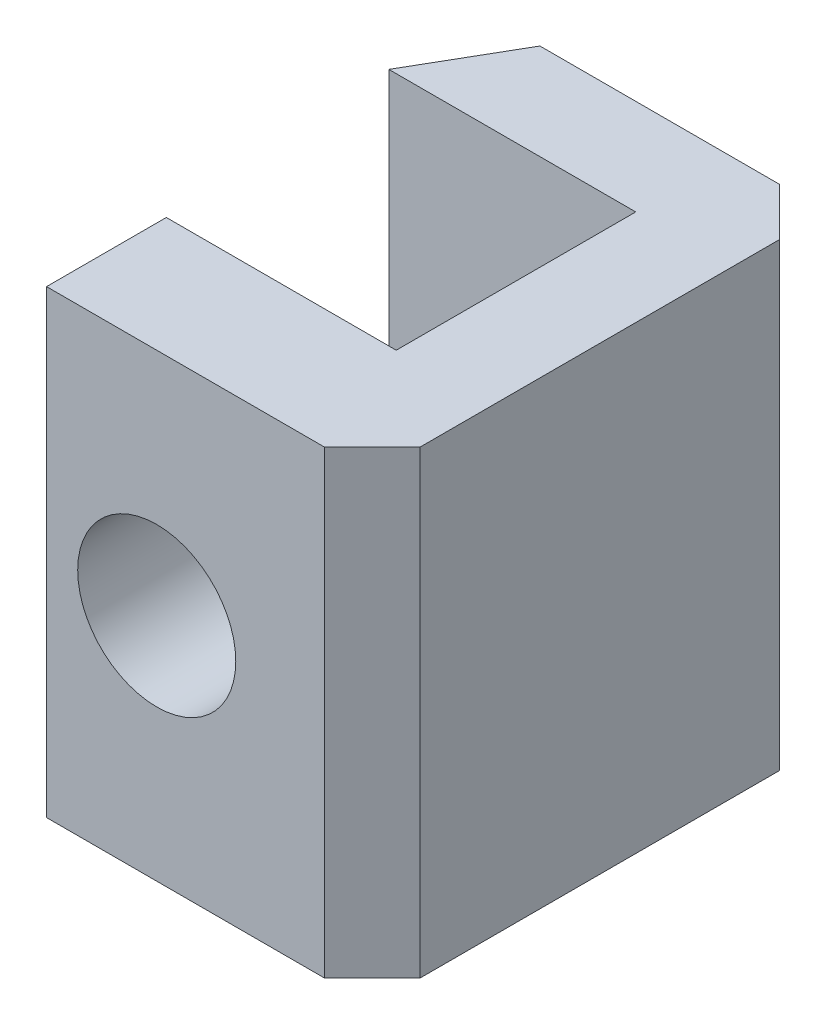
ISO-10303-21;
HEADER;
FILE_DESCRIPTION(('STEP AP214'),'2;1');
FILE_NAME('part.step','',(''),(''),'','','');
FILE_SCHEMA(('AUTOMOTIVE_DESIGN { 1 0 10303 214 1 1 1 1 }'));
ENDSEC;
DATA;
#1=APPLICATION_CONTEXT('core data for automotive mechanical design processes');
#2=APPLICATION_PROTOCOL_DEFINITION('international standard','automotive_design',2000,#1);
#3=PRODUCT_CONTEXT('',#1,'mechanical');
#4=PRODUCT('Part','Part','',(#3));
#5=PRODUCT_RELATED_PRODUCT_CATEGORY('part','',(#4));
#6=PRODUCT_DEFINITION_FORMATION('','',#4);
#7=PRODUCT_DEFINITION_CONTEXT('part definition',#1,'design');
#8=PRODUCT_DEFINITION('design','',#6,#7);
#9=PRODUCT_DEFINITION_SHAPE('','',#8);
#10=(LENGTH_UNIT() NAMED_UNIT(*) SI_UNIT(.MILLI.,.METRE.));
#11=(NAMED_UNIT(*) PLANE_ANGLE_UNIT() SI_UNIT($,.RADIAN.));
#12=(NAMED_UNIT(*) SI_UNIT($,.STERADIAN.) SOLID_ANGLE_UNIT());
#13=UNCERTAINTY_MEASURE_WITH_UNIT(LENGTH_MEASURE(1.E-05),#10,'distance_accuracy_value','');
#14=(GEOMETRIC_REPRESENTATION_CONTEXT(3) GLOBAL_UNCERTAINTY_ASSIGNED_CONTEXT((#13)) GLOBAL_UNIT_ASSIGNED_CONTEXT((#10,
#11,#12)) REPRESENTATION_CONTEXT('',''));
#15=CARTESIAN_POINT('',(0.,0.,0.));
#16=DIRECTION('',(0.,0.,1.));
#17=DIRECTION('',(1.,0.,0.));
#18=AXIS2_PLACEMENT_3D('',#15,#16,#17);
#19=CARTESIAN_POINT('',(26.381498191,-39.8816452622514,0.));
#20=DIRECTION('',(0.,0.,1.));
#21=DIRECTION('',(1.,0.,0.));
#22=AXIS2_PLACEMENT_3D('',#19,#20,#21);
#23=PLANE('',#22);
#24=CARTESIAN_POINT('',(28.681498191,-22.988801204,0.));
#25=DIRECTION('',(0.,0.,1.));
#26=DIRECTION('',(1.,0.,0.));
#27=AXIS2_PLACEMENT_3D('',#24,#25,#26);
#28=CIRCLE('',#27,1.65);
#29=CARTESIAN_POINT('',(30.331498191,-22.988801204,0.));
#30=VERTEX_POINT('',#29);
#31=EDGE_CURVE('E167',#30,#30,#28,.T.);
#32=ORIENTED_EDGE('',*,*,#31,.T.);
#33=EDGE_LOOP('',(#32));
#34=FACE_BOUND('',#33,.T.);
#35=DIRECTION('',(1.,0.,0.));
#36=VECTOR('',#35,1.);
#37=CARTESIAN_POINT('',(26.381498191,-27.788801204,0.));
#38=LINE('',#37,#36);
#39=CARTESIAN_POINT('',(26.381498191,-27.788801204,0.));
#40=VERTEX_POINT('',#39);
#41=CARTESIAN_POINT('',(31.181498191,-27.788801204,0.));
#42=VERTEX_POINT('',#41);
#43=EDGE_CURVE('E146',#40,#42,#38,.T.);
#44=ORIENTED_EDGE('',*,*,#43,.F.);
#45=DIRECTION('',(0.,1.,0.));
#46=VECTOR('',#45,1.);
#47=CARTESIAN_POINT('',(26.381498191,-39.8816452622514,0.));
#48=LINE('',#47,#46);
#49=CARTESIAN_POINT('',(26.381498191,-18.188801204,0.));
#50=VERTEX_POINT('',#49);
#51=EDGE_CURVE('E144',#40,#50,#48,.T.);
#52=ORIENTED_EDGE('',*,*,#51,.T.);
#53=DIRECTION('',(1.,0.,0.));
#54=VECTOR('',#53,1.);
#55=CARTESIAN_POINT('',(26.381498191,-18.188801204,0.));
#56=LINE('',#55,#54);
#57=CARTESIAN_POINT('',(31.181498191,-18.188801204,0.));
#58=VERTEX_POINT('',#57);
#59=EDGE_CURVE('E156',#50,#58,#56,.T.);
#60=ORIENTED_EDGE('',*,*,#59,.T.);
#61=DIRECTION('',(0.,1.,0.));
#62=VECTOR('',#61,1.);
#63=CARTESIAN_POINT('',(31.181498191,-39.8816452622514,0.));
#64=LINE('',#63,#62);
#65=EDGE_CURVE('E153',#42,#58,#64,.T.);
#66=ORIENTED_EDGE('',*,*,#65,.F.);
#67=EDGE_LOOP('',(#44,#52,#60,#66));
#68=FACE_BOUND('',#67,.T.);
#69=ADVANCED_FACE('F44',(#34,#68),#23,.F.);
#70=CARTESIAN_POINT('',(31.181498191,-39.8816452622514,-2.5));
#71=DIRECTION('',(1.,0.,0.));
#72=DIRECTION('',(0.,0.,-1.));
#73=AXIS2_PLACEMENT_3D('',#70,#71,#72);
#74=PLANE('',#73);
#75=DIRECTION('',(0.,0.,-1.));
#76=VECTOR('',#75,1.);
#77=CARTESIAN_POINT('',(31.181498191,-27.788801204,-2.5));
#78=LINE('',#77,#76);
#79=CARTESIAN_POINT('',(31.181498191,-27.788801204,-5.));
#80=VERTEX_POINT('',#79);
#81=EDGE_CURVE('E148',#42,#80,#78,.T.);
#82=ORIENTED_EDGE('',*,*,#81,.F.);
#83=ORIENTED_EDGE('',*,*,#65,.T.);
#84=DIRECTION('',(0.,0.,-1.));
#85=VECTOR('',#84,1.);
#86=CARTESIAN_POINT('',(31.181498191,-18.188801204,-2.5));
#87=LINE('',#86,#85);
#88=CARTESIAN_POINT('',(31.181498191,-18.188801204,-5.));
#89=VERTEX_POINT('',#88);
#90=EDGE_CURVE('E155',#58,#89,#87,.T.);
#91=ORIENTED_EDGE('',*,*,#90,.T.);
#92=DIRECTION('',(0.,1.,0.));
#93=VECTOR('',#92,1.);
#94=CARTESIAN_POINT('',(31.181498191,-39.8816452622514,-5.));
#95=LINE('',#94,#93);
#96=EDGE_CURVE('E157',#80,#89,#95,.T.);
#97=ORIENTED_EDGE('',*,*,#96,.F.);
#98=EDGE_LOOP('',(#82,#83,#91,#97));
#99=FACE_BOUND('',#98,.T.);
#100=ADVANCED_FACE('F218',(#99),#74,.F.);
#101=CARTESIAN_POINT('',(26.0267976526207,-39.8816452622514,-5.));
#102=DIRECTION('',(0.,0.,-1.));
#103=DIRECTION('',(-1.,0.,0.));
#104=AXIS2_PLACEMENT_3D('',#101,#102,#103);
#105=PLANE('',#104);
#106=DIRECTION('',(-1.,0.,0.));
#107=VECTOR('',#106,1.);
#108=CARTESIAN_POINT('',(26.0267976526207,-27.788801204,-5.));
#109=LINE('',#108,#107);
#110=CARTESIAN_POINT('',(26.0267976526207,-27.788801204,-5.));
#111=VERTEX_POINT('',#110);
#112=EDGE_CURVE('E212',#80,#111,#109,.T.);
#113=ORIENTED_EDGE('',*,*,#112,.F.);
#114=ORIENTED_EDGE('',*,*,#96,.T.);
#115=DIRECTION('',(-1.,0.,0.));
#116=VECTOR('',#115,1.);
#117=CARTESIAN_POINT('',(26.0267976526207,-18.188801204,-5.));
#118=LINE('',#117,#116);
#119=CARTESIAN_POINT('',(26.0267976526207,-18.188801204,-5.));
#120=VERTEX_POINT('',#119);
#121=EDGE_CURVE('E159',#89,#120,#118,.T.);
#122=ORIENTED_EDGE('',*,*,#121,.T.);
#123=DIRECTION('',(0.,1.,0.));
#124=VECTOR('',#123,1.);
#125=CARTESIAN_POINT('',(26.0267976526207,-39.8816452622514,-5.));
#126=LINE('',#125,#124);
#127=EDGE_CURVE('E160',#111,#120,#126,.T.);
#128=ORIENTED_EDGE('',*,*,#127,.F.);
#129=EDGE_LOOP('',(#113,#114,#122,#128));
#130=FACE_BOUND('',#129,.T.);
#131=ADVANCED_FACE('F225',(#130),#105,.F.);
#132=CARTESIAN_POINT('',(27.181498191,-39.8816452622514,-7.));
#133=DIRECTION('',(0.866025403784436,0.,0.500000000000005));
#134=DIRECTION('',(0.500000000000005,0.,-0.866025403784436));
#135=AXIS2_PLACEMENT_3D('',#132,#133,#134);
#136=PLANE('',#135);
#137=DIRECTION('',(0.500000000000005,0.,-0.866025403784436));
#138=VECTOR('',#137,1.);
#139=CARTESIAN_POINT('',(27.181498191,-27.788801204,-7.));
#140=LINE('',#139,#138);
#141=CARTESIAN_POINT('',(27.181498191,-27.788801204,-7.));
#142=VERTEX_POINT('',#141);
#143=EDGE_CURVE('E210',#111,#142,#140,.T.);
#144=ORIENTED_EDGE('',*,*,#143,.F.);
#145=ORIENTED_EDGE('',*,*,#127,.T.);
#146=DIRECTION('',(0.500000000000005,0.,-0.866025403784436));
#147=VECTOR('',#146,1.);
#148=CARTESIAN_POINT('',(27.181498191,-18.188801204,-7.));
#149=LINE('',#148,#147);
#150=CARTESIAN_POINT('',(27.181498191,-18.188801204,-7.));
#151=VERTEX_POINT('',#150);
#152=EDGE_CURVE('E162',#120,#151,#149,.T.);
#153=ORIENTED_EDGE('',*,*,#152,.T.);
#154=DIRECTION('',(0.,1.,0.));
#155=VECTOR('',#154,1.);
#156=CARTESIAN_POINT('',(27.181498191,-39.8816452622514,-7.));
#157=LINE('',#156,#155);
#158=EDGE_CURVE('E163',#142,#151,#157,.T.);
#159=ORIENTED_EDGE('',*,*,#158,.F.);
#160=EDGE_LOOP('',(#144,#145,#153,#159));
#161=FACE_BOUND('',#160,.T.);
#162=ADVANCED_FACE('F227',(#161),#136,.F.);
#163=CARTESIAN_POINT('',(33.181498191,-39.8816452622514,-7.));
#164=DIRECTION('',(0.,0.,1.));
#165=DIRECTION('',(1.,0.,0.));
#166=AXIS2_PLACEMENT_3D('',#163,#164,#165);
#167=PLANE('',#166);
#168=DIRECTION('',(1.,0.,0.));
#169=VECTOR('',#168,1.);
#170=CARTESIAN_POINT('',(33.181498191,-18.188801204,-7.));
#171=LINE('',#170,#169);
#172=CARTESIAN_POINT('',(32.181498191,-18.188801204,-7.));
#173=VERTEX_POINT('',#172);
#174=EDGE_CURVE('E164',#151,#173,#171,.T.);
#175=ORIENTED_EDGE('',*,*,#174,.T.);
#176=DIRECTION('',(0.,-1.,0.));
#177=VECTOR('',#176,1.);
#178=CARTESIAN_POINT('',(32.181498191,-39.8816452622514,-7.));
#179=LINE('',#178,#177);
#180=CARTESIAN_POINT('',(32.181498191,-27.788801204,-7.));
#181=VERTEX_POINT('',#180);
#182=EDGE_CURVE('E68',#173,#181,#179,.T.);
#183=ORIENTED_EDGE('',*,*,#182,.T.);
#184=DIRECTION('',(1.,0.,0.));
#185=VECTOR('',#184,1.);
#186=CARTESIAN_POINT('',(33.181498191,-27.788801204,-7.));
#187=LINE('',#186,#185);
#188=EDGE_CURVE('E180',#142,#181,#187,.T.);
#189=ORIENTED_EDGE('',*,*,#188,.F.);
#190=ORIENTED_EDGE('',*,*,#158,.T.);
#191=EDGE_LOOP('',(#175,#183,#189,#190));
#192=FACE_BOUND('',#191,.T.);
#193=ADVANCED_FACE('F195',(#192),#167,.F.);
#194=CARTESIAN_POINT('',(33.181498191,-39.8816452622514,2.5));
#195=DIRECTION('',(-1.,0.,0.));
#196=DIRECTION('',(0.,0.,1.));
#197=AXIS2_PLACEMENT_3D('',#194,#195,#196);
#198=PLANE('',#197);
#199=DIRECTION('',(0.,0.,1.));
#200=VECTOR('',#199,1.);
#201=CARTESIAN_POINT('',(33.181498191,-27.788801204,2.5));
#202=LINE('',#201,#200);
#203=CARTESIAN_POINT('',(33.181498191,-27.788801204,-6.));
#204=VERTEX_POINT('',#203);
#205=CARTESIAN_POINT('',(33.181498191,-27.788801204,1.49999999999999));
#206=VERTEX_POINT('',#205);
#207=EDGE_CURVE('E131',#204,#206,#202,.T.);
#208=ORIENTED_EDGE('',*,*,#207,.F.);
#209=DIRECTION('',(0.,1.,0.));
#210=VECTOR('',#209,1.);
#211=CARTESIAN_POINT('',(33.181498191,-39.8816452622514,-6.));
#212=LINE('',#211,#210);
#213=CARTESIAN_POINT('',(33.181498191,-18.188801204,-6.));
#214=VERTEX_POINT('',#213);
#215=EDGE_CURVE('E169',#204,#214,#212,.T.);
#216=ORIENTED_EDGE('',*,*,#215,.T.);
#217=DIRECTION('',(0.,0.,1.));
#218=VECTOR('',#217,1.);
#219=CARTESIAN_POINT('',(33.181498191,-18.188801204,2.5));
#220=LINE('',#219,#218);
#221=CARTESIAN_POINT('',(33.181498191,-18.188801204,1.49999999999999));
#222=VERTEX_POINT('',#221);
#223=EDGE_CURVE('E194',#214,#222,#220,.T.);
#224=ORIENTED_EDGE('',*,*,#223,.T.);
#225=DIRECTION('',(0.,-1.,0.));
#226=VECTOR('',#225,1.);
#227=CARTESIAN_POINT('',(33.181498191,-39.8816452622514,1.49999999999999));
#228=LINE('',#227,#226);
#229=EDGE_CURVE('E130',#222,#206,#228,.T.);
#230=ORIENTED_EDGE('',*,*,#229,.T.);
#231=EDGE_LOOP('',(#208,#216,#224,#230));
#232=FACE_BOUND('',#231,.T.);
#233=ADVANCED_FACE('F184',(#232),#198,.F.);
#234=CARTESIAN_POINT('',(26.381498191,-39.8816452622514,2.5));
#235=DIRECTION('',(0.,0.,-1.));
#236=DIRECTION('',(-1.,0.,0.));
#237=AXIS2_PLACEMENT_3D('',#234,#235,#236);
#238=PLANE('',#237);
#239=CARTESIAN_POINT('',(28.681498191,-22.988801204,2.5));
#240=DIRECTION('',(0.,0.,1.));
#241=DIRECTION('',(1.,0.,0.));
#242=AXIS2_PLACEMENT_3D('',#239,#240,#241);
#243=CIRCLE('',#242,1.65);
#244=CARTESIAN_POINT('',(30.331498191,-22.988801204,2.5));
#245=VERTEX_POINT('',#244);
#246=EDGE_CURVE('E345',#245,#245,#243,.T.);
#247=ORIENTED_EDGE('',*,*,#246,.F.);
#248=EDGE_LOOP('',(#247));
#249=FACE_BOUND('',#248,.T.);
#250=DIRECTION('',(-1.,0.,0.));
#251=VECTOR('',#250,1.);
#252=CARTESIAN_POINT('',(26.381498191,-27.788801204,2.5));
#253=LINE('',#252,#251);
#254=CARTESIAN_POINT('',(32.181498191,-27.788801204,2.5));
#255=VERTEX_POINT('',#254);
#256=CARTESIAN_POINT('',(26.381498191,-27.788801204,2.5));
#257=VERTEX_POINT('',#256);
#258=EDGE_CURVE('E122',#255,#257,#253,.T.);
#259=ORIENTED_EDGE('',*,*,#258,.F.);
#260=DIRECTION('',(0.,1.,0.));
#261=VECTOR('',#260,1.);
#262=CARTESIAN_POINT('',(32.181498191,-39.8816452622514,2.5));
#263=LINE('',#262,#261);
#264=CARTESIAN_POINT('',(32.181498191,-18.188801204,2.5));
#265=VERTEX_POINT('',#264);
#266=EDGE_CURVE('E12',#255,#265,#263,.T.);
#267=ORIENTED_EDGE('',*,*,#266,.T.);
#268=DIRECTION('',(-1.,0.,0.));
#269=VECTOR('',#268,1.);
#270=CARTESIAN_POINT('',(26.381498191,-18.188801204,2.5));
#271=LINE('',#270,#269);
#272=CARTESIAN_POINT('',(26.381498191,-18.188801204,2.5));
#273=VERTEX_POINT('',#272);
#274=EDGE_CURVE('E137',#265,#273,#271,.T.);
#275=ORIENTED_EDGE('',*,*,#274,.T.);
#276=DIRECTION('',(0.,1.,0.));
#277=VECTOR('',#276,1.);
#278=CARTESIAN_POINT('',(26.381498191,-39.8816452622514,2.5));
#279=LINE('',#278,#277);
#280=EDGE_CURVE('E134',#257,#273,#279,.T.);
#281=ORIENTED_EDGE('',*,*,#280,.F.);
#282=EDGE_LOOP('',(#259,#267,#275,#281));
#283=FACE_BOUND('',#282,.T.);
#284=ADVANCED_FACE('F135',(#249,#283),#238,.F.);
#285=CARTESIAN_POINT('',(26.381498191,-39.8816452622514,0.));
#286=DIRECTION('',(1.,0.,0.));
#287=DIRECTION('',(0.,0.,-1.));
#288=AXIS2_PLACEMENT_3D('',#285,#286,#287);
#289=PLANE('',#288);
#290=DIRECTION('',(0.,0.,-1.));
#291=VECTOR('',#290,1.);
#292=CARTESIAN_POINT('',(26.381498191,-27.788801204,0.));
#293=LINE('',#292,#291);
#294=EDGE_CURVE('E127',#257,#40,#293,.T.);
#295=ORIENTED_EDGE('',*,*,#294,.F.);
#296=ORIENTED_EDGE('',*,*,#280,.T.);
#297=DIRECTION('',(0.,0.,-1.));
#298=VECTOR('',#297,1.);
#299=CARTESIAN_POINT('',(26.381498191,-18.188801204,0.));
#300=LINE('',#299,#298);
#301=EDGE_CURVE('E141',#273,#50,#300,.T.);
#302=ORIENTED_EDGE('',*,*,#301,.T.);
#303=ORIENTED_EDGE('',*,*,#51,.F.);
#304=EDGE_LOOP('',(#295,#296,#302,#303));
#305=FACE_BOUND('',#304,.T.);
#306=ADVANCED_FACE('F143',(#305),#289,.F.);
#307=CARTESIAN_POINT('',(0.,-18.188801204,0.));
#308=DIRECTION('',(0.,-1.,0.));
#309=DIRECTION('',(0.,0.,-1.));
#310=AXIS2_PLACEMENT_3D('',#307,#308,#309);
#311=PLANE('',#310);
#312=ORIENTED_EDGE('',*,*,#223,.F.);
#313=DIRECTION('',(0.707106781186548,0.,0.707106781186548));
#314=VECTOR('',#313,1.);
#315=CARTESIAN_POINT('',(33.181498191,-18.188801204,-6.));
#316=LINE('',#315,#314);
#317=EDGE_CURVE('E174',#214,#173,#316,.F.);
#318=ORIENTED_EDGE('',*,*,#317,.T.);
#319=ORIENTED_EDGE('',*,*,#174,.F.);
#320=ORIENTED_EDGE('',*,*,#152,.F.);
#321=ORIENTED_EDGE('',*,*,#121,.F.);
#322=ORIENTED_EDGE('',*,*,#90,.F.);
#323=ORIENTED_EDGE('',*,*,#59,.F.);
#324=ORIENTED_EDGE('',*,*,#301,.F.);
#325=ORIENTED_EDGE('',*,*,#274,.F.);
#326=DIRECTION('',(-0.707106781186544,0.,0.707106781186551));
#327=VECTOR('',#326,1.);
#328=CARTESIAN_POINT('',(32.181498191,-18.188801204,2.5));
#329=LINE('',#328,#327);
#330=EDGE_CURVE('E172',#265,#222,#329,.F.);
#331=ORIENTED_EDGE('',*,*,#330,.T.);
#332=EDGE_LOOP('',(#312,#318,#319,#320,#321,#322,#323,#324,#325,#331));
#333=FACE_BOUND('',#332,.T.);
#334=ADVANCED_FACE('F192',(#333),#311,.F.);
#335=CARTESIAN_POINT('',(31.181498191,-27.788801204,-16.1803398874989));
#336=DIRECTION('',(0.,-1.,0.));
#337=DIRECTION('',(1.,0.,0.));
#338=AXIS2_PLACEMENT_3D('',#335,#336,#337);
#339=PLANE('',#338);
#340=ORIENTED_EDGE('',*,*,#188,.T.);
#341=DIRECTION('',(-0.707106781186548,0.,-0.707106781186548));
#342=VECTOR('',#341,1.);
#343=CARTESIAN_POINT('',(27.0913282472505,-27.788801204,-12.0901699437495));
#344=LINE('',#343,#342);
#345=EDGE_CURVE('E53',#181,#204,#344,.F.);
#346=ORIENTED_EDGE('',*,*,#345,.T.);
#347=ORIENTED_EDGE('',*,*,#207,.T.);
#348=DIRECTION('',(0.707106781186544,0.,-0.707106781186551));
#349=VECTOR('',#348,1.);
#350=CARTESIAN_POINT('',(41.0216681347495,-27.788801204,-6.34016994374957));
#351=LINE('',#350,#349);
#352=EDGE_CURVE('E60',#206,#255,#351,.F.);
#353=ORIENTED_EDGE('',*,*,#352,.T.);
#354=ORIENTED_EDGE('',*,*,#258,.T.);
#355=ORIENTED_EDGE('',*,*,#294,.T.);
#356=ORIENTED_EDGE('',*,*,#43,.T.);
#357=ORIENTED_EDGE('',*,*,#81,.T.);
#358=ORIENTED_EDGE('',*,*,#112,.T.);
#359=ORIENTED_EDGE('',*,*,#143,.T.);
#360=EDGE_LOOP('',(#340,#346,#347,#353,#354,#355,#356,#357,#358,#359));
#361=FACE_BOUND('',#360,.T.);
#362=ADVANCED_FACE('F124',(#361),#339,.T.);
#363=CARTESIAN_POINT('',(28.681498191,-22.988801204,-2.5));
#364=DIRECTION('',(0.,0.,1.));
#365=DIRECTION('',(1.,0.,0.));
#366=AXIS2_PLACEMENT_3D('',#363,#364,#365);
#367=CYLINDRICAL_SURFACE('',#366,1.65);
#368=ORIENTED_EDGE('',*,*,#246,.T.);
#369=EDGE_LOOP('',(#368));
#370=FACE_BOUND('',#369,.T.);
#371=ORIENTED_EDGE('',*,*,#31,.F.);
#372=EDGE_LOOP('',(#371));
#373=FACE_BOUND('',#372,.T.);
#374=ADVANCED_FACE('F248',(#370,#373),#367,.F.);
#375=CARTESIAN_POINT('',(33.181498191,-39.8816452622514,-6.));
#376=DIRECTION('',(-0.707106781186547,0.,0.707106781186547));
#377=DIRECTION('',(0.,1.,0.));
#378=AXIS2_PLACEMENT_3D('',#375,#376,#377);
#379=PLANE('',#378);
#380=ORIENTED_EDGE('',*,*,#345,.F.);
#381=ORIENTED_EDGE('',*,*,#182,.F.);
#382=ORIENTED_EDGE('',*,*,#317,.F.);
#383=ORIENTED_EDGE('',*,*,#215,.F.);
#384=EDGE_LOOP('',(#380,#381,#382,#383));
#385=FACE_BOUND('',#384,.T.);
#386=ADVANCED_FACE('F189',(#385),#379,.F.);
#387=CARTESIAN_POINT('',(32.181498191,-39.8816452622514,2.5));
#388=DIRECTION('',(-0.707106781186551,0.,-0.707106781186544));
#389=DIRECTION('',(0.,1.,0.));
#390=AXIS2_PLACEMENT_3D('',#387,#388,#389);
#391=PLANE('',#390);
#392=ORIENTED_EDGE('',*,*,#352,.F.);
#393=ORIENTED_EDGE('',*,*,#229,.F.);
#394=ORIENTED_EDGE('',*,*,#330,.F.);
#395=ORIENTED_EDGE('',*,*,#266,.F.);
#396=EDGE_LOOP('',(#392,#393,#394,#395));
#397=FACE_BOUND('',#396,.T.);
#398=ADVANCED_FACE('F47',(#397),#391,.F.);
#399=CLOSED_SHELL('',(#69,#100,#131,#162,#193,#233,#284,#306,#334,#362,#374,#386,#398));
#400=MANIFOLD_SOLID_BREP('B2',#399);
#401=ADVANCED_BREP_SHAPE_REPRESENTATION('',(#18,#400),#14);
#402=SHAPE_DEFINITION_REPRESENTATION(#9,#401);
ENDSEC;
END-ISO-10303-21;
